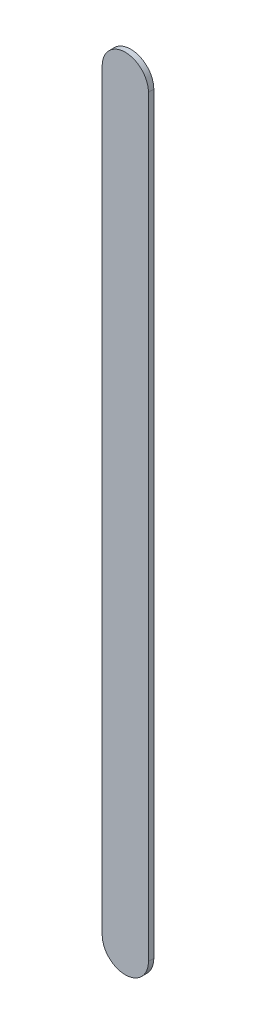
ISO-10303-21;
HEADER;
FILE_DESCRIPTION(('STEP AP214'),'2;1');
FILE_NAME('part.step','',(''),(''),'','','');
FILE_SCHEMA(('AUTOMOTIVE_DESIGN { 1 0 10303 214 1 1 1 1 }'));
ENDSEC;
DATA;
#1=APPLICATION_CONTEXT('core data for automotive mechanical design processes');
#2=APPLICATION_PROTOCOL_DEFINITION('international standard','automotive_design',2000,#1);
#3=PRODUCT_CONTEXT('',#1,'mechanical');
#4=PRODUCT('Part','Part','',(#3));
#5=PRODUCT_RELATED_PRODUCT_CATEGORY('part','',(#4));
#6=PRODUCT_DEFINITION_FORMATION('','',#4);
#7=PRODUCT_DEFINITION_CONTEXT('part definition',#1,'design');
#8=PRODUCT_DEFINITION('design','',#6,#7);
#9=PRODUCT_DEFINITION_SHAPE('','',#8);
#10=(LENGTH_UNIT() NAMED_UNIT(*) SI_UNIT(.MILLI.,.METRE.));
#11=(NAMED_UNIT(*) PLANE_ANGLE_UNIT() SI_UNIT($,.RADIAN.));
#12=(NAMED_UNIT(*) SI_UNIT($,.STERADIAN.) SOLID_ANGLE_UNIT());
#13=UNCERTAINTY_MEASURE_WITH_UNIT(LENGTH_MEASURE(1.E-05),#10,'distance_accuracy_value','');
#14=(GEOMETRIC_REPRESENTATION_CONTEXT(3) GLOBAL_UNCERTAINTY_ASSIGNED_CONTEXT((#13)) GLOBAL_UNIT_ASSIGNED_CONTEXT((#10,
#11,#12)) REPRESENTATION_CONTEXT('',''));
#15=CARTESIAN_POINT('',(0.,0.,0.));
#16=DIRECTION('',(0.,0.,1.));
#17=DIRECTION('',(1.,0.,0.));
#18=AXIS2_PLACEMENT_3D('',#15,#16,#17);
#19=CARTESIAN_POINT('',(124.85,-69.9125,1.635));
#20=DIRECTION('',(0.,0.,1.));
#21=DIRECTION('',(1.,0.,0.));
#22=AXIS2_PLACEMENT_3D('',#19,#20,#21);
#23=PLANE('',#22);
#24=DIRECTION('',(0.,-1.,0.));
#25=VECTOR('',#24,1.);
#26=CARTESIAN_POINT('',(124.85,-69.9125,1.635));
#27=LINE('',#26,#25);
#28=CARTESIAN_POINT('',(124.85,-69.9125,1.635));
#29=VERTEX_POINT('',#28);
#30=CARTESIAN_POINT('',(124.85,-74.8,1.635));
#31=VERTEX_POINT('',#30);
#32=EDGE_CURVE('E80',#29,#31,#27,.T.);
#33=ORIENTED_EDGE('',*,*,#32,.T.);
#34=CARTESIAN_POINT('',(125.,-74.8,1.635));
#35=DIRECTION('',(0.,0.,1.));
#36=DIRECTION('',(-1.,0.,0.));
#37=AXIS2_PLACEMENT_3D('',#34,#35,#36);
#38=CIRCLE('',#37,0.15);
#39=CARTESIAN_POINT('',(125.15,-74.8,1.635));
#40=VERTEX_POINT('',#39);
#41=EDGE_CURVE('E78',#31,#40,#38,.T.);
#42=ORIENTED_EDGE('',*,*,#41,.T.);
#43=DIRECTION('',(0.,1.,0.));
#44=VECTOR('',#43,1.);
#45=CARTESIAN_POINT('',(125.15,-74.8,1.635));
#46=LINE('',#45,#44);
#47=CARTESIAN_POINT('',(125.15,-69.9125,1.635));
#48=VERTEX_POINT('',#47);
#49=EDGE_CURVE('E66',#40,#48,#46,.T.);
#50=ORIENTED_EDGE('',*,*,#49,.T.);
#51=CARTESIAN_POINT('',(125.,-69.9125,1.635));
#52=DIRECTION('',(0.,0.,1.));
#53=DIRECTION('',(1.,0.,0.));
#54=AXIS2_PLACEMENT_3D('',#51,#52,#53);
#55=CIRCLE('',#54,0.15);
#56=EDGE_CURVE('E11',#48,#29,#55,.T.);
#57=ORIENTED_EDGE('',*,*,#56,.T.);
#58=EDGE_LOOP('',(#33,#42,#50,#57));
#59=FACE_BOUND('',#58,.T.);
#60=ADVANCED_FACE('F17',(#59),#23,.T.);
#61=CARTESIAN_POINT('',(124.85,-69.9125,1.6));
#62=DIRECTION('',(0.,0.,1.));
#63=DIRECTION('',(1.,0.,0.));
#64=AXIS2_PLACEMENT_3D('',#61,#62,#63);
#65=PLANE('',#64);
#66=CARTESIAN_POINT('',(125.,-69.9125,1.6));
#67=DIRECTION('',(0.,0.,1.));
#68=DIRECTION('',(1.,0.,0.));
#69=AXIS2_PLACEMENT_3D('',#66,#67,#68);
#70=CIRCLE('',#69,0.15);
#71=CARTESIAN_POINT('',(125.15,-69.9125,1.6));
#72=VERTEX_POINT('',#71);
#73=CARTESIAN_POINT('',(124.85,-69.9125,1.6));
#74=VERTEX_POINT('',#73);
#75=EDGE_CURVE('E20',#72,#74,#70,.T.);
#76=ORIENTED_EDGE('',*,*,#75,.F.);
#77=DIRECTION('',(0.,1.,0.));
#78=VECTOR('',#77,1.);
#79=CARTESIAN_POINT('',(125.15,-74.8,1.6));
#80=LINE('',#79,#78);
#81=CARTESIAN_POINT('',(125.15,-74.8,1.6));
#82=VERTEX_POINT('',#81);
#83=EDGE_CURVE('E85',#82,#72,#80,.T.);
#84=ORIENTED_EDGE('',*,*,#83,.F.);
#85=CARTESIAN_POINT('',(125.,-74.8,1.6));
#86=DIRECTION('',(0.,0.,1.));
#87=DIRECTION('',(-1.,0.,0.));
#88=AXIS2_PLACEMENT_3D('',#85,#86,#87);
#89=CIRCLE('',#88,0.15);
#90=CARTESIAN_POINT('',(124.85,-74.8,1.6));
#91=VERTEX_POINT('',#90);
#92=EDGE_CURVE('E88',#91,#82,#89,.T.);
#93=ORIENTED_EDGE('',*,*,#92,.F.);
#94=DIRECTION('',(0.,-1.,0.));
#95=VECTOR('',#94,1.);
#96=CARTESIAN_POINT('',(124.85,-69.9125,1.6));
#97=LINE('',#96,#95);
#98=EDGE_CURVE('E138',#74,#91,#97,.T.);
#99=ORIENTED_EDGE('',*,*,#98,.F.);
#100=EDGE_LOOP('',(#76,#84,#93,#99));
#101=FACE_BOUND('',#100,.T.);
#102=ADVANCED_FACE('F153',(#101),#65,.F.);
#103=CARTESIAN_POINT('',(125.,-69.9125,1.6));
#104=DIRECTION('',(0.,0.,-1.));
#105=DIRECTION('',(1.,0.,0.));
#106=AXIS2_PLACEMENT_3D('',#103,#104,#105);
#107=CYLINDRICAL_SURFACE('',#106,0.15);
#108=ORIENTED_EDGE('',*,*,#75,.T.);
#109=DIRECTION('',(0.,0.,1.));
#110=VECTOR('',#109,1.);
#111=CARTESIAN_POINT('',(124.85,-69.9125,1.6));
#112=LINE('',#111,#110);
#113=EDGE_CURVE('E95',#74,#29,#112,.T.);
#114=ORIENTED_EDGE('',*,*,#113,.T.);
#115=ORIENTED_EDGE('',*,*,#56,.F.);
#116=DIRECTION('',(0.,0.,1.));
#117=VECTOR('',#116,1.);
#118=CARTESIAN_POINT('',(125.15,-69.9125,1.6));
#119=LINE('',#118,#117);
#120=EDGE_CURVE('E73',#72,#48,#119,.T.);
#121=ORIENTED_EDGE('',*,*,#120,.F.);
#122=EDGE_LOOP('',(#108,#114,#115,#121));
#123=FACE_BOUND('',#122,.T.);
#124=ADVANCED_FACE('F154',(#123),#107,.T.);
#125=CARTESIAN_POINT('',(125.15,-74.8,1.6));
#126=DIRECTION('',(-1.,0.,0.));
#127=DIRECTION('',(0.,0.,1.));
#128=AXIS2_PLACEMENT_3D('',#125,#126,#127);
#129=PLANE('',#128);
#130=ORIENTED_EDGE('',*,*,#83,.T.);
#131=ORIENTED_EDGE('',*,*,#120,.T.);
#132=ORIENTED_EDGE('',*,*,#49,.F.);
#133=DIRECTION('',(0.,0.,1.));
#134=VECTOR('',#133,1.);
#135=CARTESIAN_POINT('',(125.15,-74.8,1.6));
#136=LINE('',#135,#134);
#137=EDGE_CURVE('E71',#82,#40,#136,.T.);
#138=ORIENTED_EDGE('',*,*,#137,.F.);
#139=EDGE_LOOP('',(#130,#131,#132,#138));
#140=FACE_BOUND('',#139,.T.);
#141=ADVANCED_FACE('F69',(#140),#129,.F.);
#142=CARTESIAN_POINT('',(125.,-74.8,1.6));
#143=DIRECTION('',(0.,0.,-1.));
#144=DIRECTION('',(-1.,0.,0.));
#145=AXIS2_PLACEMENT_3D('',#142,#143,#144);
#146=CYLINDRICAL_SURFACE('',#145,0.15);
#147=ORIENTED_EDGE('',*,*,#92,.T.);
#148=ORIENTED_EDGE('',*,*,#137,.T.);
#149=ORIENTED_EDGE('',*,*,#41,.F.);
#150=DIRECTION('',(0.,0.,1.));
#151=VECTOR('',#150,1.);
#152=CARTESIAN_POINT('',(124.85,-74.8,1.6));
#153=LINE('',#152,#151);
#154=EDGE_CURVE('E133',#91,#31,#153,.T.);
#155=ORIENTED_EDGE('',*,*,#154,.F.);
#156=EDGE_LOOP('',(#147,#148,#149,#155));
#157=FACE_BOUND('',#156,.T.);
#158=ADVANCED_FACE('F87',(#157),#146,.T.);
#159=CARTESIAN_POINT('',(124.85,-69.9125,1.6));
#160=DIRECTION('',(1.,0.,0.));
#161=DIRECTION('',(0.,1.,0.));
#162=AXIS2_PLACEMENT_3D('',#159,#160,#161);
#163=PLANE('',#162);
#164=ORIENTED_EDGE('',*,*,#98,.T.);
#165=ORIENTED_EDGE('',*,*,#154,.T.);
#166=ORIENTED_EDGE('',*,*,#32,.F.);
#167=ORIENTED_EDGE('',*,*,#113,.F.);
#168=EDGE_LOOP('',(#164,#165,#166,#167));
#169=FACE_BOUND('',#168,.T.);
#170=ADVANCED_FACE('F151',(#169),#163,.F.);
#171=CLOSED_SHELL('',(#60,#102,#124,#141,#158,#170));
#172=MANIFOLD_SOLID_BREP('B1',#171);
#173=ADVANCED_BREP_SHAPE_REPRESENTATION('',(#18,#172),#14);
#174=SHAPE_DEFINITION_REPRESENTATION(#9,#173);
ENDSEC;
END-ISO-10303-21;
